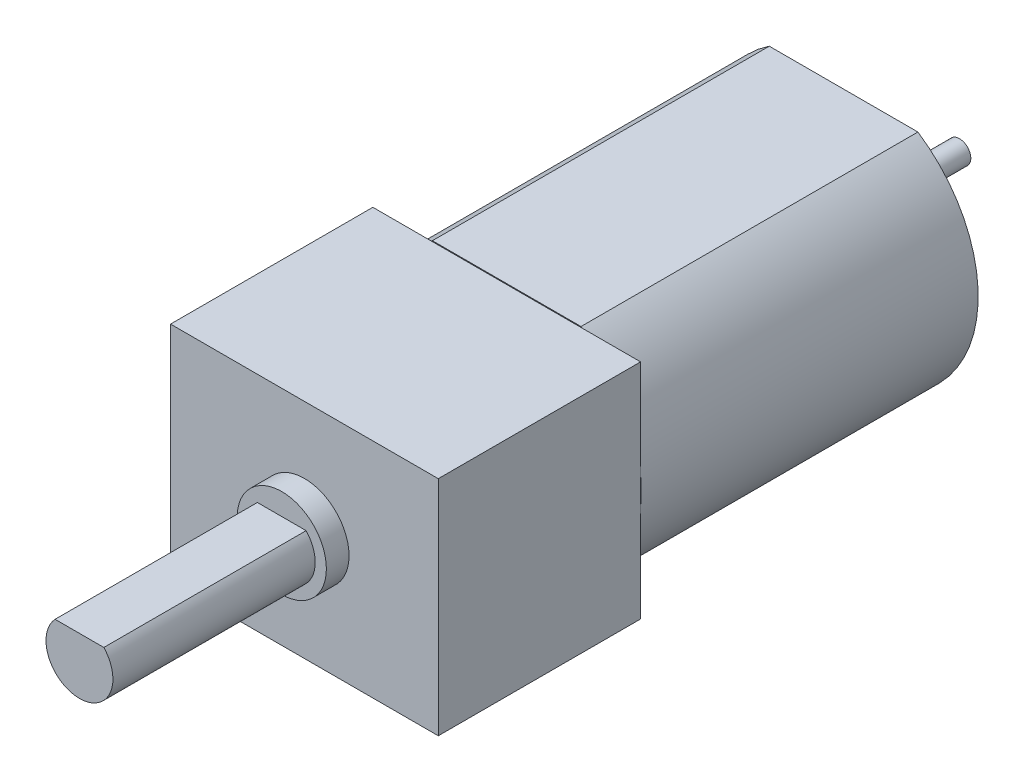
ISO-10303-21;
HEADER;
FILE_DESCRIPTION(('STEP AP214'),'2;1');
FILE_NAME('part.step','',(''),(''),'','','');
FILE_SCHEMA(('AUTOMOTIVE_DESIGN { 1 0 10303 214 1 1 1 1 }'));
ENDSEC;
DATA;
#1=APPLICATION_CONTEXT('core data for automotive mechanical design processes');
#2=APPLICATION_PROTOCOL_DEFINITION('international standard','automotive_design',2000,#1);
#3=PRODUCT_CONTEXT('',#1,'mechanical');
#4=PRODUCT('Part','Part','',(#3));
#5=PRODUCT_RELATED_PRODUCT_CATEGORY('part','',(#4));
#6=PRODUCT_DEFINITION_FORMATION('','',#4);
#7=PRODUCT_DEFINITION_CONTEXT('part definition',#1,'design');
#8=PRODUCT_DEFINITION('design','',#6,#7);
#9=PRODUCT_DEFINITION_SHAPE('','',#8);
#10=(LENGTH_UNIT() NAMED_UNIT(*) SI_UNIT(.MILLI.,.METRE.));
#11=(NAMED_UNIT(*) PLANE_ANGLE_UNIT() SI_UNIT($,.RADIAN.));
#12=(NAMED_UNIT(*) SI_UNIT($,.STERADIAN.) SOLID_ANGLE_UNIT());
#13=UNCERTAINTY_MEASURE_WITH_UNIT(LENGTH_MEASURE(1.E-05),#10,'distance_accuracy_value','');
#14=(GEOMETRIC_REPRESENTATION_CONTEXT(3) GLOBAL_UNCERTAINTY_ASSIGNED_CONTEXT((#13)) GLOBAL_UNIT_ASSIGNED_CONTEXT((#10,
#11,#12)) REPRESENTATION_CONTEXT('',''));
#15=CARTESIAN_POINT('',(0.,0.,0.));
#16=DIRECTION('',(0.,0.,1.));
#17=DIRECTION('',(1.,0.,0.));
#18=AXIS2_PLACEMENT_3D('',#15,#16,#17);
#19=CARTESIAN_POINT('',(11.587620820127,-8.95396543595786,-15.9893));
#20=DIRECTION('',(0.,0.,-1.));
#21=DIRECTION('',(-1.,0.,0.));
#22=AXIS2_PLACEMENT_3D('',#19,#20,#21);
#23=PLANE('',#22);
#24=CARTESIAN_POINT('',(11.587620820127,-8.95396543595786,-15.9893));
#25=DIRECTION('',(0.,0.,-1.));
#26=DIRECTION('',(-1.,0.,0.));
#27=AXIS2_PLACEMENT_3D('',#24,#25,#26);
#28=CIRCLE('',#27,2.5146);
#29=CARTESIAN_POINT('',(9.07302082012705,-8.95396543595786,-15.9893));
#30=VERTEX_POINT('',#29);
#31=EDGE_CURVE('E522',#30,#30,#28,.T.);
#32=ORIENTED_EDGE('',*,*,#31,.T.);
#33=EDGE_LOOP('',(#32));
#34=FACE_BOUND('',#33,.T.);
#35=CARTESIAN_POINT('',(11.587620820127,-8.95396543595786,-15.9893));
#36=DIRECTION('',(0.,0.,-1.));
#37=DIRECTION('',(-1.,0.,0.));
#38=AXIS2_PLACEMENT_3D('',#35,#36,#37);
#39=CIRCLE('',#38,0.508);
#40=CARTESIAN_POINT('',(11.079620820127,-8.95396543595786,-15.9893));
#41=VERTEX_POINT('',#40);
#42=EDGE_CURVE('E519',#41,#41,#39,.T.);
#43=ORIENTED_EDGE('',*,*,#42,.F.);
#44=EDGE_LOOP('',(#43));
#45=FACE_BOUND('',#44,.T.);
#46=ADVANCED_FACE('F40',(#34,#45),#23,.T.);
#47=CARTESIAN_POINT('',(11.587620820127,-8.95396543595786,-15.1003));
#48=DIRECTION('',(0.,0.,-1.));
#49=DIRECTION('',(-1.,0.,0.));
#50=AXIS2_PLACEMENT_3D('',#47,#48,#49);
#51=PLANE('',#50);
#52=CARTESIAN_POINT('',(11.587620820127,-8.95396543595786,-15.1003));
#53=DIRECTION('',(0.,0.,-1.));
#54=DIRECTION('',(-1.,0.,0.));
#55=AXIS2_PLACEMENT_3D('',#52,#53,#54);
#56=CIRCLE('',#55,6.0325);
#57=CARTESIAN_POINT('',(14.9190174656798,-3.92476543595786,-15.1003));
#58=VERTEX_POINT('',#57);
#59=CARTESIAN_POINT('',(14.9190174656798,-13.9831654359579,-15.1003));
#60=VERTEX_POINT('',#59);
#61=EDGE_CURVE('E170',#58,#60,#56,.T.);
#62=ORIENTED_EDGE('',*,*,#61,.T.);
#63=DIRECTION('',(-1.,0.,0.));
#64=VECTOR('',#63,1.);
#65=CARTESIAN_POINT('',(14.9190174656798,-13.9831654359579,-15.1003));
#66=LINE('',#65,#64);
#67=CARTESIAN_POINT('',(8.25622417457432,-13.9831654359579,-15.1003));
#68=VERTEX_POINT('',#67);
#69=EDGE_CURVE('E173',#60,#68,#66,.T.);
#70=ORIENTED_EDGE('',*,*,#69,.T.);
#71=CARTESIAN_POINT('',(11.587620820127,-8.95396543595786,-15.1003));
#72=DIRECTION('',(0.,0.,-1.));
#73=DIRECTION('',(-1.,0.,0.));
#74=AXIS2_PLACEMENT_3D('',#71,#72,#73);
#75=CIRCLE('',#74,6.0325);
#76=CARTESIAN_POINT('',(8.25622417457431,-3.92476543595786,-15.1003));
#77=VERTEX_POINT('',#76);
#78=EDGE_CURVE('E176',#68,#77,#75,.T.);
#79=ORIENTED_EDGE('',*,*,#78,.T.);
#80=DIRECTION('',(1.,0.,0.));
#81=VECTOR('',#80,1.);
#82=CARTESIAN_POINT('',(14.9190174656798,-3.92476543595786,-15.1003));
#83=LINE('',#82,#81);
#84=EDGE_CURVE('E178',#77,#58,#83,.T.);
#85=ORIENTED_EDGE('',*,*,#84,.T.);
#86=EDGE_LOOP('',(#62,#70,#79,#85));
#87=FACE_BOUND('',#86,.T.);
#88=CARTESIAN_POINT('',(11.587620820127,-8.95396543595786,-15.1003));
#89=DIRECTION('',(0.,0.,-1.));
#90=DIRECTION('',(-1.,0.,0.));
#91=AXIS2_PLACEMENT_3D('',#88,#89,#90);
#92=CIRCLE('',#91,2.5146);
#93=CARTESIAN_POINT('',(9.07302082012705,-8.95396543595786,-15.1003));
#94=VERTEX_POINT('',#93);
#95=EDGE_CURVE('E518',#94,#94,#92,.T.);
#96=ORIENTED_EDGE('',*,*,#95,.F.);
#97=EDGE_LOOP('',(#96));
#98=FACE_BOUND('',#97,.T.);
#99=ADVANCED_FACE('F270',(#87,#98),#51,.T.);
#100=CARTESIAN_POINT('',(11.587620820127,-8.95396543595786,10.0838));
#101=DIRECTION('',(0.,0.,1.));
#102=DIRECTION('',(1.,0.,0.));
#103=AXIS2_PLACEMENT_3D('',#100,#101,#102);
#104=PLANE('',#103);
#105=CARTESIAN_POINT('',(11.587620820127,-8.95396543595786,10.0838));
#106=DIRECTION('',(0.,0.,1.));
#107=DIRECTION('',(1.,0.,0.));
#108=AXIS2_PLACEMENT_3D('',#105,#106,#107);
#109=CIRCLE('',#108,2.00025);
#110=CARTESIAN_POINT('',(13.587870820127,-8.95396543595786,10.0838));
#111=VERTEX_POINT('',#110);
#112=EDGE_CURVE('E162',#111,#111,#109,.T.);
#113=ORIENTED_EDGE('',*,*,#112,.T.);
#114=EDGE_LOOP('',(#113));
#115=FACE_BOUND('',#114,.T.);
#116=DIRECTION('',(-1.,0.,0.));
#117=VECTOR('',#116,1.);
#118=CARTESIAN_POINT('',(10.4946182080533,-7.92666543595786,10.0838));
#119=LINE('',#118,#117);
#120=CARTESIAN_POINT('',(12.6806234322008,-7.92666543595786,10.0838));
#121=VERTEX_POINT('',#120);
#122=CARTESIAN_POINT('',(10.4946182080533,-7.92666543595786,10.0838));
#123=VERTEX_POINT('',#122);
#124=EDGE_CURVE('E156',#121,#123,#119,.T.);
#125=ORIENTED_EDGE('',*,*,#124,.F.);
#126=CARTESIAN_POINT('',(11.587620820127,-8.95396543595786,10.0838));
#127=DIRECTION('',(0.,0.,1.));
#128=DIRECTION('',(1.,0.,0.));
#129=AXIS2_PLACEMENT_3D('',#126,#127,#128);
#130=CIRCLE('',#129,1.5);
#131=EDGE_CURVE('E58',#123,#121,#130,.T.);
#132=ORIENTED_EDGE('',*,*,#131,.F.);
#133=EDGE_LOOP('',(#125,#132));
#134=FACE_BOUND('',#133,.T.);
#135=ADVANCED_FACE('F313',(#115,#134),#104,.T.);
#136=CARTESIAN_POINT('',(5.58687082012705,-13.9450654359579,9.0678));
#137=DIRECTION('',(0.,0.,1.));
#138=DIRECTION('',(1.,0.,0.));
#139=AXIS2_PLACEMENT_3D('',#136,#137,#138);
#140=PLANE('',#139);
#141=DIRECTION('',(0.,-1.,0.));
#142=VECTOR('',#141,1.);
#143=CARTESIAN_POINT('',(5.58687082012705,-3.96286543595786,9.0678));
#144=LINE('',#143,#142);
#145=CARTESIAN_POINT('',(5.58687082012705,-3.96286543595786,9.0678));
#146=VERTEX_POINT('',#145);
#147=CARTESIAN_POINT('',(5.58687082012705,-13.9450654359579,9.0678));
#148=VERTEX_POINT('',#147);
#149=EDGE_CURVE('E204',#146,#148,#144,.T.);
#150=ORIENTED_EDGE('',*,*,#149,.T.);
#151=DIRECTION('',(1.,0.,0.));
#152=VECTOR('',#151,1.);
#153=CARTESIAN_POINT('',(5.58687082012705,-13.9450654359579,9.0678));
#154=LINE('',#153,#152);
#155=CARTESIAN_POINT('',(17.588370820127,-13.9450654359579,9.0678));
#156=VERTEX_POINT('',#155);
#157=EDGE_CURVE('E207',#148,#156,#154,.T.);
#158=ORIENTED_EDGE('',*,*,#157,.T.);
#159=DIRECTION('',(0.,1.,0.));
#160=VECTOR('',#159,1.);
#161=CARTESIAN_POINT('',(17.588370820127,-3.96286543595786,9.0678));
#162=LINE('',#161,#160);
#163=CARTESIAN_POINT('',(17.588370820127,-3.96286543595786,9.0678));
#164=VERTEX_POINT('',#163);
#165=EDGE_CURVE('E210',#156,#164,#162,.T.);
#166=ORIENTED_EDGE('',*,*,#165,.T.);
#167=DIRECTION('',(-1.,0.,0.));
#168=VECTOR('',#167,1.);
#169=CARTESIAN_POINT('',(5.58687082012705,-3.96286543595786,9.0678));
#170=LINE('',#169,#168);
#171=EDGE_CURVE('E212',#164,#146,#170,.T.);
#172=ORIENTED_EDGE('',*,*,#171,.T.);
#173=EDGE_LOOP('',(#150,#158,#166,#172));
#174=FACE_BOUND('',#173,.T.);
#175=CARTESIAN_POINT('',(11.587620820127,-8.95396543595786,9.0678));
#176=DIRECTION('',(0.,0.,1.));
#177=DIRECTION('',(1.,0.,0.));
#178=AXIS2_PLACEMENT_3D('',#175,#176,#177);
#179=CIRCLE('',#178,2.00025);
#180=CARTESIAN_POINT('',(13.587870820127,-8.95396543595786,9.0678));
#181=VERTEX_POINT('',#180);
#182=EDGE_CURVE('E159',#181,#181,#179,.T.);
#183=ORIENTED_EDGE('',*,*,#182,.F.);
#184=EDGE_LOOP('',(#183));
#185=FACE_BOUND('',#184,.T.);
#186=ADVANCED_FACE('F285',(#174,#185),#140,.T.);
#187=CARTESIAN_POINT('',(5.58687082012705,-13.9450654359579,0.));
#188=DIRECTION('',(0.,0.,1.));
#189=DIRECTION('',(1.,0.,0.));
#190=AXIS2_PLACEMENT_3D('',#187,#188,#189);
#191=PLANE('',#190);
#192=CARTESIAN_POINT('',(11.587620820127,-8.95396543595786,0.));
#193=DIRECTION('',(0.,0.,-1.));
#194=DIRECTION('',(-1.,0.,0.));
#195=AXIS2_PLACEMENT_3D('',#192,#193,#194);
#196=CIRCLE('',#195,6.0325);
#197=CARTESIAN_POINT('',(14.97583230113,-3.96286543595786,0.));
#198=VERTEX_POINT('',#197);
#199=CARTESIAN_POINT('',(17.588370820127,-8.33585890185548,0.));
#200=VERTEX_POINT('',#199);
#201=EDGE_CURVE('E11',#198,#200,#196,.T.);
#202=ORIENTED_EDGE('',*,*,#201,.F.);
#203=DIRECTION('',(-1.,0.,0.));
#204=VECTOR('',#203,1.);
#205=CARTESIAN_POINT('',(5.58687082012705,-3.96286543595786,0.));
#206=LINE('',#205,#204);
#207=CARTESIAN_POINT('',(17.588370820127,-3.96286543595786,0.));
#208=VERTEX_POINT('',#207);
#209=EDGE_CURVE('E208',#208,#198,#206,.T.);
#210=ORIENTED_EDGE('',*,*,#209,.F.);
#211=DIRECTION('',(0.,1.,0.));
#212=VECTOR('',#211,1.);
#213=CARTESIAN_POINT('',(17.588370820127,-3.96286543595786,0.));
#214=LINE('',#213,#212);
#215=EDGE_CURVE('E222',#200,#208,#214,.T.);
#216=ORIENTED_EDGE('',*,*,#215,.F.);
#217=EDGE_LOOP('',(#202,#210,#216));
#218=FACE_BOUND('',#217,.T.);
#219=ADVANCED_FACE('F304',(#218),#191,.F.);
#220=CARTESIAN_POINT('',(17.588370820127,-9.57207197006024,0.));
#221=VERTEX_POINT('',#220);
#222=CARTESIAN_POINT('',(14.97583230113,-13.9450654359579,0.));
#223=VERTEX_POINT('',#222);
#224=EDGE_CURVE('E49',#221,#223,#196,.T.);
#225=ORIENTED_EDGE('',*,*,#224,.F.);
#226=CARTESIAN_POINT('',(17.588370820127,-13.9450654359579,0.));
#227=VERTEX_POINT('',#226);
#228=EDGE_CURVE('E224',#227,#221,#214,.T.);
#229=ORIENTED_EDGE('',*,*,#228,.F.);
#230=DIRECTION('',(1.,0.,0.));
#231=VECTOR('',#230,1.);
#232=CARTESIAN_POINT('',(5.58687082012705,-13.9450654359579,0.));
#233=LINE('',#232,#231);
#234=EDGE_CURVE('E66',#223,#227,#233,.T.);
#235=ORIENTED_EDGE('',*,*,#234,.F.);
#236=EDGE_LOOP('',(#225,#229,#235));
#237=FACE_BOUND('',#236,.T.);
#238=ADVANCED_FACE('F297',(#237),#191,.F.);
#239=CARTESIAN_POINT('',(11.587620820127,-8.95396543595786,0.));
#240=DIRECTION('',(0.,0.,-1.));
#241=DIRECTION('',(-1.,0.,0.));
#242=AXIS2_PLACEMENT_3D('',#239,#240,#241);
#243=CIRCLE('',#242,6.0325);
#244=CARTESIAN_POINT('',(8.19940933912413,-13.9450654359579,0.));
#245=VERTEX_POINT('',#244);
#246=CARTESIAN_POINT('',(5.58687082012705,-9.5720719700602,0.));
#247=VERTEX_POINT('',#246);
#248=EDGE_CURVE('E245',#245,#247,#243,.T.);
#249=ORIENTED_EDGE('',*,*,#248,.F.);
#250=CARTESIAN_POINT('',(5.58687082012705,-13.9450654359579,0.));
#251=VERTEX_POINT('',#250);
#252=EDGE_CURVE('E219',#251,#245,#233,.T.);
#253=ORIENTED_EDGE('',*,*,#252,.F.);
#254=DIRECTION('',(0.,-1.,0.));
#255=VECTOR('',#254,1.);
#256=CARTESIAN_POINT('',(5.58687082012705,-3.96286543595786,0.));
#257=LINE('',#256,#255);
#258=EDGE_CURVE('E203',#247,#251,#257,.T.);
#259=ORIENTED_EDGE('',*,*,#258,.F.);
#260=EDGE_LOOP('',(#249,#253,#259));
#261=FACE_BOUND('',#260,.T.);
#262=ADVANCED_FACE('F294',(#261),#191,.F.);
#263=CARTESIAN_POINT('',(5.58687082012705,-8.33585890185552,0.));
#264=VERTEX_POINT('',#263);
#265=CARTESIAN_POINT('',(8.19940933912413,-3.96286543595786,0.));
#266=VERTEX_POINT('',#265);
#267=EDGE_CURVE('E190',#264,#266,#243,.T.);
#268=ORIENTED_EDGE('',*,*,#267,.F.);
#269=CARTESIAN_POINT('',(5.58687082012705,-3.96286543595786,0.));
#270=VERTEX_POINT('',#269);
#271=EDGE_CURVE('E215',#270,#264,#257,.T.);
#272=ORIENTED_EDGE('',*,*,#271,.F.);
#273=EDGE_CURVE('E227',#266,#270,#206,.T.);
#274=ORIENTED_EDGE('',*,*,#273,.F.);
#275=EDGE_LOOP('',(#268,#272,#274));
#276=FACE_BOUND('',#275,.T.);
#277=ADVANCED_FACE('F296',(#276),#191,.F.);
#278=CARTESIAN_POINT('',(5.58687082012705,-3.96286543595786,9.0678));
#279=DIRECTION('',(1.,0.,0.));
#280=DIRECTION('',(0.,1.,0.));
#281=AXIS2_PLACEMENT_3D('',#278,#279,#280);
#282=PLANE('',#281);
#283=ORIENTED_EDGE('',*,*,#271,.T.);
#284=EDGE_CURVE('E218',#264,#247,#257,.T.);
#285=ORIENTED_EDGE('',*,*,#284,.T.);
#286=ORIENTED_EDGE('',*,*,#258,.T.);
#287=DIRECTION('',(0.,0.,-1.));
#288=VECTOR('',#287,1.);
#289=CARTESIAN_POINT('',(5.58687082012705,-13.9450654359579,9.0678));
#290=LINE('',#289,#288);
#291=EDGE_CURVE('E44',#148,#251,#290,.T.);
#292=ORIENTED_EDGE('',*,*,#291,.F.);
#293=ORIENTED_EDGE('',*,*,#149,.F.);
#294=DIRECTION('',(0.,0.,-1.));
#295=VECTOR('',#294,1.);
#296=CARTESIAN_POINT('',(5.58687082012705,-3.96286543595786,9.0678));
#297=LINE('',#296,#295);
#298=EDGE_CURVE('E214',#146,#270,#297,.T.);
#299=ORIENTED_EDGE('',*,*,#298,.T.);
#300=EDGE_LOOP('',(#283,#285,#286,#292,#293,#299));
#301=FACE_BOUND('',#300,.T.);
#302=ADVANCED_FACE('F42',(#301),#282,.F.);
#303=CARTESIAN_POINT('',(5.58687082012705,-13.9450654359579,9.0678));
#304=DIRECTION('',(0.,1.,0.));
#305=DIRECTION('',(0.,0.,1.));
#306=AXIS2_PLACEMENT_3D('',#303,#304,#305);
#307=PLANE('',#306);
#308=ORIENTED_EDGE('',*,*,#252,.T.);
#309=EDGE_CURVE('E223',#245,#223,#233,.T.);
#310=ORIENTED_EDGE('',*,*,#309,.T.);
#311=ORIENTED_EDGE('',*,*,#234,.T.);
#312=DIRECTION('',(0.,0.,-1.));
#313=VECTOR('',#312,1.);
#314=CARTESIAN_POINT('',(17.588370820127,-13.9450654359579,9.0678));
#315=LINE('',#314,#313);
#316=EDGE_CURVE('E236',#156,#227,#315,.T.);
#317=ORIENTED_EDGE('',*,*,#316,.F.);
#318=ORIENTED_EDGE('',*,*,#157,.F.);
#319=ORIENTED_EDGE('',*,*,#291,.T.);
#320=EDGE_LOOP('',(#308,#310,#311,#317,#318,#319));
#321=FACE_BOUND('',#320,.T.);
#322=ADVANCED_FACE('F280',(#321),#307,.F.);
#323=CARTESIAN_POINT('',(17.588370820127,-3.96286543595786,9.0678));
#324=DIRECTION('',(-1.,0.,0.));
#325=DIRECTION('',(0.,-1.,0.));
#326=AXIS2_PLACEMENT_3D('',#323,#324,#325);
#327=PLANE('',#326);
#328=ORIENTED_EDGE('',*,*,#228,.T.);
#329=EDGE_CURVE('E228',#221,#200,#214,.T.);
#330=ORIENTED_EDGE('',*,*,#329,.T.);
#331=ORIENTED_EDGE('',*,*,#215,.T.);
#332=DIRECTION('',(0.,0.,-1.));
#333=VECTOR('',#332,1.);
#334=CARTESIAN_POINT('',(17.588370820127,-3.96286543595786,9.0678));
#335=LINE('',#334,#333);
#336=EDGE_CURVE('E234',#164,#208,#335,.T.);
#337=ORIENTED_EDGE('',*,*,#336,.F.);
#338=ORIENTED_EDGE('',*,*,#165,.F.);
#339=ORIENTED_EDGE('',*,*,#316,.T.);
#340=EDGE_LOOP('',(#328,#330,#331,#337,#338,#339));
#341=FACE_BOUND('',#340,.T.);
#342=ADVANCED_FACE('F282',(#341),#327,.F.);
#343=CARTESIAN_POINT('',(5.58687082012705,-3.96286543595786,9.0678));
#344=DIRECTION('',(0.,-1.,0.));
#345=DIRECTION('',(0.,0.,-1.));
#346=AXIS2_PLACEMENT_3D('',#343,#344,#345);
#347=PLANE('',#346);
#348=ORIENTED_EDGE('',*,*,#209,.T.);
#349=EDGE_CURVE('E231',#198,#266,#206,.T.);
#350=ORIENTED_EDGE('',*,*,#349,.T.);
#351=ORIENTED_EDGE('',*,*,#273,.T.);
#352=ORIENTED_EDGE('',*,*,#298,.F.);
#353=ORIENTED_EDGE('',*,*,#171,.F.);
#354=ORIENTED_EDGE('',*,*,#336,.T.);
#355=EDGE_LOOP('',(#348,#350,#351,#352,#353,#354));
#356=FACE_BOUND('',#355,.T.);
#357=ADVANCED_FACE('F360',(#356),#347,.F.);
#358=CARTESIAN_POINT('',(11.587620820127,-8.95396543595786,0.));
#359=DIRECTION('',(0.,0.,-1.));
#360=DIRECTION('',(-1.,0.,0.));
#361=AXIS2_PLACEMENT_3D('',#358,#359,#360);
#362=PLANE('',#361);
#363=ORIENTED_EDGE('',*,*,#284,.F.);
#364=EDGE_CURVE('E189',#247,#264,#243,.T.);
#365=ORIENTED_EDGE('',*,*,#364,.F.);
#366=EDGE_LOOP('',(#363,#365));
#367=FACE_BOUND('',#366,.T.);
#368=ADVANCED_FACE('F340',(#367),#362,.F.);
#369=ORIENTED_EDGE('',*,*,#349,.F.);
#370=CARTESIAN_POINT('',(14.9190174656798,-3.92476543595786,0.));
#371=VERTEX_POINT('',#370);
#372=EDGE_CURVE('E180',#371,#198,#196,.T.);
#373=ORIENTED_EDGE('',*,*,#372,.F.);
#374=DIRECTION('',(1.,0.,0.));
#375=VECTOR('',#374,1.);
#376=CARTESIAN_POINT('',(14.9190174656798,-3.92476543595786,0.));
#377=LINE('',#376,#375);
#378=CARTESIAN_POINT('',(8.25622417457431,-3.92476543595786,0.));
#379=VERTEX_POINT('',#378);
#380=EDGE_CURVE('E174',#379,#371,#377,.T.);
#381=ORIENTED_EDGE('',*,*,#380,.F.);
#382=EDGE_CURVE('E185',#266,#379,#243,.T.);
#383=ORIENTED_EDGE('',*,*,#382,.F.);
#384=EDGE_LOOP('',(#369,#373,#381,#383));
#385=FACE_BOUND('',#384,.T.);
#386=ADVANCED_FACE('F263',(#385),#362,.F.);
#387=ORIENTED_EDGE('',*,*,#329,.F.);
#388=EDGE_CURVE('E51',#200,#221,#196,.T.);
#389=ORIENTED_EDGE('',*,*,#388,.F.);
#390=EDGE_LOOP('',(#387,#389));
#391=FACE_BOUND('',#390,.T.);
#392=ADVANCED_FACE('F341',(#391),#362,.F.);
#393=CARTESIAN_POINT('',(11.587620820127,-8.95396543595786,-15.1003));
#394=DIRECTION('',(0.,0.,1.));
#395=DIRECTION('',(1.,0.,0.));
#396=AXIS2_PLACEMENT_3D('',#393,#394,#395);
#397=CYLINDRICAL_SURFACE('',#396,6.0325);
#398=ORIENTED_EDGE('',*,*,#372,.T.);
#399=ORIENTED_EDGE('',*,*,#201,.T.);
#400=ORIENTED_EDGE('',*,*,#388,.T.);
#401=ORIENTED_EDGE('',*,*,#224,.T.);
#402=CARTESIAN_POINT('',(14.9190174656798,-13.9831654359579,0.));
#403=VERTEX_POINT('',#402);
#404=EDGE_CURVE('E168',#223,#403,#196,.T.);
#405=ORIENTED_EDGE('',*,*,#404,.T.);
#406=DIRECTION('',(0.,0.,1.));
#407=VECTOR('',#406,1.);
#408=CARTESIAN_POINT('',(14.9190174656798,-13.9831654359579,-15.1003));
#409=LINE('',#408,#407);
#410=EDGE_CURVE('E200',#60,#403,#409,.T.);
#411=ORIENTED_EDGE('',*,*,#410,.F.);
#412=ORIENTED_EDGE('',*,*,#61,.F.);
#413=DIRECTION('',(0.,0.,1.));
#414=VECTOR('',#413,1.);
#415=CARTESIAN_POINT('',(14.9190174656798,-3.92476543595786,-15.1003));
#416=LINE('',#415,#414);
#417=EDGE_CURVE('E179',#58,#371,#416,.T.);
#418=ORIENTED_EDGE('',*,*,#417,.T.);
#419=EDGE_LOOP('',(#398,#399,#400,#401,#405,#411,#412,#418));
#420=FACE_BOUND('',#419,.T.);
#421=ADVANCED_FACE('F265',(#420),#397,.T.);
#422=CARTESIAN_POINT('',(14.9190174656798,-13.9831654359579,-15.1003));
#423=DIRECTION('',(0.,1.,0.));
#424=DIRECTION('',(-1.,0.,0.));
#425=AXIS2_PLACEMENT_3D('',#422,#423,#424);
#426=PLANE('',#425);
#427=DIRECTION('',(-1.,0.,0.));
#428=VECTOR('',#427,1.);
#429=CARTESIAN_POINT('',(14.9190174656798,-13.9831654359579,0.));
#430=LINE('',#429,#428);
#431=CARTESIAN_POINT('',(8.25622417457432,-13.9831654359579,0.));
#432=VERTEX_POINT('',#431);
#433=EDGE_CURVE('E183',#403,#432,#430,.T.);
#434=ORIENTED_EDGE('',*,*,#433,.T.);
#435=DIRECTION('',(0.,0.,1.));
#436=VECTOR('',#435,1.);
#437=CARTESIAN_POINT('',(8.25622417457432,-13.9831654359579,-15.1003));
#438=LINE('',#437,#436);
#439=EDGE_CURVE('E197',#68,#432,#438,.T.);
#440=ORIENTED_EDGE('',*,*,#439,.F.);
#441=ORIENTED_EDGE('',*,*,#69,.F.);
#442=ORIENTED_EDGE('',*,*,#410,.T.);
#443=EDGE_LOOP('',(#434,#440,#441,#442));
#444=FACE_BOUND('',#443,.T.);
#445=ADVANCED_FACE('F346',(#444),#426,.F.);
#446=CARTESIAN_POINT('',(11.587620820127,-8.95396543595786,-15.1003));
#447=DIRECTION('',(0.,0.,1.));
#448=DIRECTION('',(1.,0.,0.));
#449=AXIS2_PLACEMENT_3D('',#446,#447,#448);
#450=CYLINDRICAL_SURFACE('',#449,6.0325);
#451=EDGE_CURVE('E186',#432,#245,#243,.T.);
#452=ORIENTED_EDGE('',*,*,#451,.T.);
#453=ORIENTED_EDGE('',*,*,#248,.T.);
#454=ORIENTED_EDGE('',*,*,#364,.T.);
#455=ORIENTED_EDGE('',*,*,#267,.T.);
#456=ORIENTED_EDGE('',*,*,#382,.T.);
#457=DIRECTION('',(0.,0.,1.));
#458=VECTOR('',#457,1.);
#459=CARTESIAN_POINT('',(8.25622417457431,-3.92476543595786,-15.1003));
#460=LINE('',#459,#458);
#461=EDGE_CURVE('E194',#77,#379,#460,.T.);
#462=ORIENTED_EDGE('',*,*,#461,.F.);
#463=ORIENTED_EDGE('',*,*,#78,.F.);
#464=ORIENTED_EDGE('',*,*,#439,.T.);
#465=EDGE_LOOP('',(#452,#453,#454,#455,#456,#462,#463,#464));
#466=FACE_BOUND('',#465,.T.);
#467=ADVANCED_FACE('F253',(#466),#450,.T.);
#468=CARTESIAN_POINT('',(14.9190174656798,-3.92476543595786,-15.1003));
#469=DIRECTION('',(0.,-1.,0.));
#470=DIRECTION('',(1.,0.,0.));
#471=AXIS2_PLACEMENT_3D('',#468,#469,#470);
#472=PLANE('',#471);
#473=ORIENTED_EDGE('',*,*,#380,.T.);
#474=ORIENTED_EDGE('',*,*,#417,.F.);
#475=ORIENTED_EDGE('',*,*,#84,.F.);
#476=ORIENTED_EDGE('',*,*,#461,.T.);
#477=EDGE_LOOP('',(#473,#474,#475,#476));
#478=FACE_BOUND('',#477,.T.);
#479=ADVANCED_FACE('F260',(#478),#472,.F.);
#480=ORIENTED_EDGE('',*,*,#309,.F.);
#481=ORIENTED_EDGE('',*,*,#451,.F.);
#482=ORIENTED_EDGE('',*,*,#433,.F.);
#483=ORIENTED_EDGE('',*,*,#404,.F.);
#484=EDGE_LOOP('',(#480,#481,#482,#483));
#485=FACE_BOUND('',#484,.T.);
#486=ADVANCED_FACE('F278',(#485),#362,.F.);
#487=CARTESIAN_POINT('',(11.587620820127,-8.95396543595786,10.0838));
#488=DIRECTION('',(0.,0.,-1.));
#489=DIRECTION('',(-1.,0.,0.));
#490=AXIS2_PLACEMENT_3D('',#487,#488,#489);
#491=CYLINDRICAL_SURFACE('',#490,2.00025);
#492=ORIENTED_EDGE('',*,*,#112,.F.);
#493=EDGE_LOOP('',(#492));
#494=FACE_BOUND('',#493,.T.);
#495=ORIENTED_EDGE('',*,*,#182,.T.);
#496=EDGE_LOOP('',(#495));
#497=FACE_BOUND('',#496,.T.);
#498=ADVANCED_FACE('F331',(#494,#497),#491,.T.);
#499=CARTESIAN_POINT('',(11.587620820127,-8.95396543595786,19.1516));
#500=DIRECTION('',(0.,0.,-1.));
#501=DIRECTION('',(-1.,0.,0.));
#502=AXIS2_PLACEMENT_3D('',#499,#500,#501);
#503=CYLINDRICAL_SURFACE('',#502,1.5);
#504=ORIENTED_EDGE('',*,*,#131,.T.);
#505=DIRECTION('',(0.,0.,-1.));
#506=VECTOR('',#505,1.);
#507=CARTESIAN_POINT('',(12.6806234322008,-7.92666543595786,19.1516));
#508=LINE('',#507,#506);
#509=CARTESIAN_POINT('',(12.6806234322008,-7.92666543595786,19.1516));
#510=VERTEX_POINT('',#509);
#511=EDGE_CURVE('E148',#510,#121,#508,.T.);
#512=ORIENTED_EDGE('',*,*,#511,.F.);
#513=CARTESIAN_POINT('',(11.587620820127,-8.95396543595786,19.1516));
#514=DIRECTION('',(0.,0.,1.));
#515=DIRECTION('',(1.,0.,0.));
#516=AXIS2_PLACEMENT_3D('',#513,#514,#515);
#517=CIRCLE('',#516,1.5);
#518=CARTESIAN_POINT('',(10.4946182080533,-7.92666543595786,19.1516));
#519=VERTEX_POINT('',#518);
#520=EDGE_CURVE('E153',#519,#510,#517,.T.);
#521=ORIENTED_EDGE('',*,*,#520,.F.);
#522=DIRECTION('',(0.,0.,-1.));
#523=VECTOR('',#522,1.);
#524=CARTESIAN_POINT('',(10.4946182080533,-7.92666543595786,19.1516));
#525=LINE('',#524,#523);
#526=EDGE_CURVE('E150',#519,#123,#525,.T.);
#527=ORIENTED_EDGE('',*,*,#526,.T.);
#528=EDGE_LOOP('',(#504,#512,#521,#527));
#529=FACE_BOUND('',#528,.T.);
#530=ADVANCED_FACE('F158',(#529),#503,.T.);
#531=CARTESIAN_POINT('',(10.4946182080533,-7.92666543595786,19.1516));
#532=DIRECTION('',(0.,-1.,0.));
#533=DIRECTION('',(0.,0.,-1.));
#534=AXIS2_PLACEMENT_3D('',#531,#532,#533);
#535=PLANE('',#534);
#536=ORIENTED_EDGE('',*,*,#124,.T.);
#537=ORIENTED_EDGE('',*,*,#526,.F.);
#538=DIRECTION('',(-1.,0.,0.));
#539=VECTOR('',#538,1.);
#540=CARTESIAN_POINT('',(10.4946182080533,-7.92666543595786,19.1516));
#541=LINE('',#540,#539);
#542=EDGE_CURVE('E145',#510,#519,#541,.T.);
#543=ORIENTED_EDGE('',*,*,#542,.F.);
#544=ORIENTED_EDGE('',*,*,#511,.T.);
#545=EDGE_LOOP('',(#536,#537,#543,#544));
#546=FACE_BOUND('',#545,.T.);
#547=ADVANCED_FACE('F147',(#546),#535,.F.);
#548=CARTESIAN_POINT('',(11.587620820127,-8.95396543595786,19.1516));
#549=DIRECTION('',(0.,0.,1.));
#550=DIRECTION('',(1.,0.,0.));
#551=AXIS2_PLACEMENT_3D('',#548,#549,#550);
#552=PLANE('',#551);
#553=ORIENTED_EDGE('',*,*,#520,.T.);
#554=ORIENTED_EDGE('',*,*,#542,.T.);
#555=EDGE_LOOP('',(#553,#554));
#556=FACE_BOUND('',#555,.T.);
#557=ADVANCED_FACE('F155',(#556),#552,.T.);
#558=CARTESIAN_POINT('',(11.587620820127,-8.95396543595786,-15.9893));
#559=DIRECTION('',(0.,0.,1.));
#560=DIRECTION('',(1.,0.,0.));
#561=AXIS2_PLACEMENT_3D('',#558,#559,#560);
#562=CYLINDRICAL_SURFACE('',#561,2.5146);
#563=ORIENTED_EDGE('',*,*,#31,.F.);
#564=EDGE_LOOP('',(#563));
#565=FACE_BOUND('',#564,.T.);
#566=ORIENTED_EDGE('',*,*,#95,.T.);
#567=EDGE_LOOP('',(#566));
#568=FACE_BOUND('',#567,.T.);
#569=ADVANCED_FACE('F321',(#565,#568),#562,.T.);
#570=CARTESIAN_POINT('',(11.587620820127,-8.95396543595786,-20.2946));
#571=DIRECTION('',(0.,0.,1.));
#572=DIRECTION('',(1.,0.,0.));
#573=AXIS2_PLACEMENT_3D('',#570,#571,#572);
#574=CYLINDRICAL_SURFACE('',#573,0.508);
#575=CARTESIAN_POINT('',(11.587620820127,-8.95396543595786,-20.2946));
#576=DIRECTION('',(0.,0.,-1.));
#577=DIRECTION('',(-1.,0.,0.));
#578=AXIS2_PLACEMENT_3D('',#575,#576,#577);
#579=CIRCLE('',#578,0.508);
#580=CARTESIAN_POINT('',(11.079620820127,-8.95396543595786,-20.2946));
#581=VERTEX_POINT('',#580);
#582=EDGE_CURVE('E517',#581,#581,#579,.T.);
#583=ORIENTED_EDGE('',*,*,#582,.F.);
#584=EDGE_LOOP('',(#583));
#585=FACE_BOUND('',#584,.T.);
#586=ORIENTED_EDGE('',*,*,#42,.T.);
#587=EDGE_LOOP('',(#586));
#588=FACE_BOUND('',#587,.T.);
#589=ADVANCED_FACE('F319',(#585,#588),#574,.T.);
#590=CARTESIAN_POINT('',(11.587620820127,-8.95396543595786,-20.2946));
#591=DIRECTION('',(0.,0.,-1.));
#592=DIRECTION('',(-1.,0.,0.));
#593=AXIS2_PLACEMENT_3D('',#590,#591,#592);
#594=PLANE('',#593);
#595=ORIENTED_EDGE('',*,*,#582,.T.);
#596=EDGE_LOOP('',(#595));
#597=FACE_BOUND('',#596,.T.);
#598=ADVANCED_FACE('F492',(#597),#594,.T.);
#599=CLOSED_SHELL('',(#46,#99,#135,#186,#219,#238,#262,#277,#302,#322,#342,#357,#368,#386,#392,
#421,#445,#467,#479,#486,#498,#530,#547,#557,#569,#589,#598));
#600=MANIFOLD_SOLID_BREP('B2',#599);
#601=ADVANCED_BREP_SHAPE_REPRESENTATION('',(#18,#600),#14);
#602=SHAPE_DEFINITION_REPRESENTATION(#9,#601);
ENDSEC;
END-ISO-10303-21;
